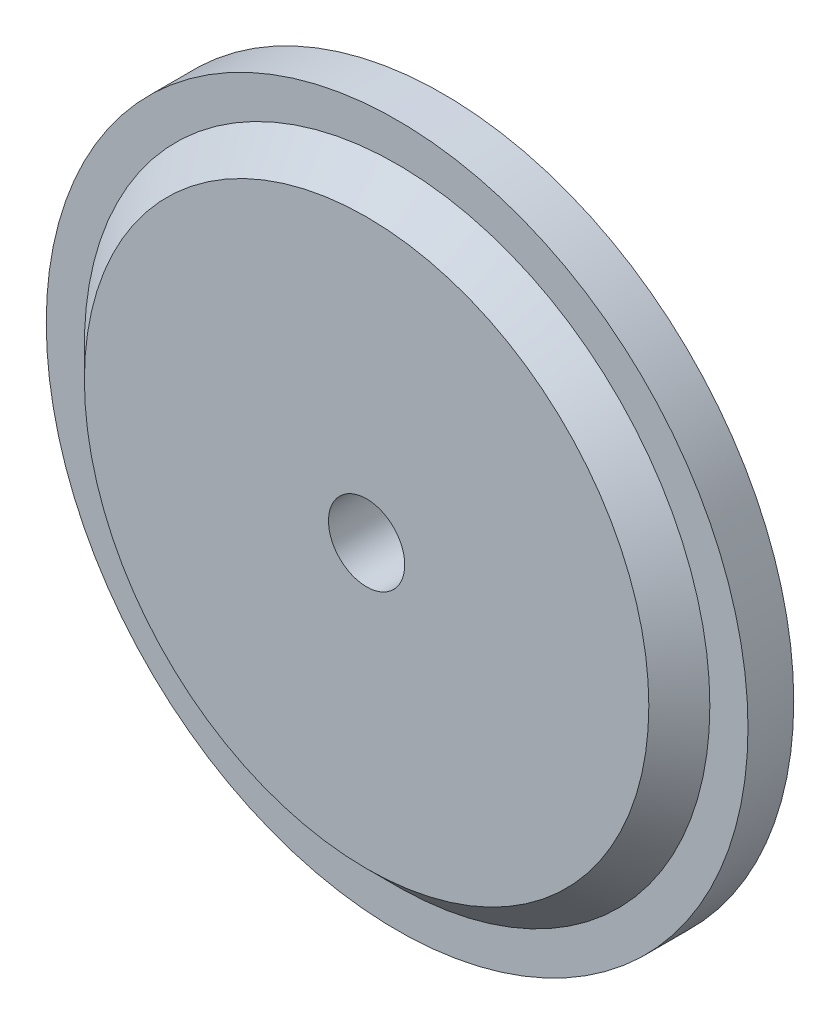
ISO-10303-21;
HEADER;
FILE_DESCRIPTION(('STEP AP214'),'2;1');
FILE_NAME('part.step','',(''),(''),'','','');
FILE_SCHEMA(('AUTOMOTIVE_DESIGN { 1 0 10303 214 1 1 1 1 }'));
ENDSEC;
DATA;
#1=APPLICATION_CONTEXT('core data for automotive mechanical design processes');
#2=APPLICATION_PROTOCOL_DEFINITION('international standard','automotive_design',2000,#1);
#3=PRODUCT_CONTEXT('',#1,'mechanical');
#4=PRODUCT('Part','Part','',(#3));
#5=PRODUCT_RELATED_PRODUCT_CATEGORY('part','',(#4));
#6=PRODUCT_DEFINITION_FORMATION('','',#4);
#7=PRODUCT_DEFINITION_CONTEXT('part definition',#1,'design');
#8=PRODUCT_DEFINITION('design','',#6,#7);
#9=PRODUCT_DEFINITION_SHAPE('','',#8);
#10=(LENGTH_UNIT() NAMED_UNIT(*) SI_UNIT(.MILLI.,.METRE.));
#11=(NAMED_UNIT(*) PLANE_ANGLE_UNIT() SI_UNIT($,.RADIAN.));
#12=(NAMED_UNIT(*) SI_UNIT($,.STERADIAN.) SOLID_ANGLE_UNIT());
#13=UNCERTAINTY_MEASURE_WITH_UNIT(LENGTH_MEASURE(1.E-05),#10,'distance_accuracy_value','');
#14=(GEOMETRIC_REPRESENTATION_CONTEXT(3) GLOBAL_UNCERTAINTY_ASSIGNED_CONTEXT((#13)) GLOBAL_UNIT_ASSIGNED_CONTEXT((#10,
#11,#12)) REPRESENTATION_CONTEXT('',''));
#15=CARTESIAN_POINT('',(0.,0.,0.));
#16=DIRECTION('',(0.,0.,1.));
#17=DIRECTION('',(1.,0.,0.));
#18=AXIS2_PLACEMENT_3D('',#15,#16,#17);
#19=CARTESIAN_POINT('',(0.,0.,6.35));
#20=DIRECTION('',(0.,0.,1.));
#21=DIRECTION('',(1.,0.,0.));
#22=AXIS2_PLACEMENT_3D('',#19,#20,#21);
#23=PLANE('',#22);
#24=CARTESIAN_POINT('',(0.,0.,6.35));
#25=DIRECTION('',(0.,0.,1.));
#26=DIRECTION('',(1.,0.,0.));
#27=AXIS2_PLACEMENT_3D('',#24,#25,#26);
#28=CIRCLE('',#27,3.175);
#29=CARTESIAN_POINT('',(3.175,0.,6.35));
#30=VERTEX_POINT('',#29);
#31=EDGE_CURVE('E39',#30,#30,#28,.T.);
#32=ORIENTED_EDGE('',*,*,#31,.F.);
#33=EDGE_LOOP('',(#32));
#34=FACE_BOUND('',#33,.T.);
#35=CARTESIAN_POINT('',(0.,0.,6.35));
#36=DIRECTION('',(0.,0.,1.));
#37=DIRECTION('',(1.,0.,0.));
#38=AXIS2_PLACEMENT_3D('',#35,#36,#37);
#39=CIRCLE('',#38,23.495);
#40=CARTESIAN_POINT('',(23.495,0.,6.35));
#41=VERTEX_POINT('',#40);
#42=EDGE_CURVE('E55',#41,#41,#39,.T.);
#43=ORIENTED_EDGE('',*,*,#42,.T.);
#44=EDGE_LOOP('',(#43));
#45=FACE_BOUND('',#44,.T.);
#46=ADVANCED_FACE('F32',(#34,#45),#23,.T.);
#47=CARTESIAN_POINT('',(0.,0.,6.35));
#48=DIRECTION('',(0.,0.,-1.));
#49=DIRECTION('',(-1.,0.,0.));
#50=AXIS2_PLACEMENT_3D('',#47,#48,#49);
#51=CYLINDRICAL_SURFACE('',#50,29.21);
#52=CARTESIAN_POINT('',(0.,0.,0.));
#53=DIRECTION('',(0.,0.,1.));
#54=DIRECTION('',(1.,0.,0.));
#55=AXIS2_PLACEMENT_3D('',#52,#53,#54);
#56=CIRCLE('',#55,29.21);
#57=CARTESIAN_POINT('',(29.21,0.,0.));
#58=VERTEX_POINT('',#57);
#59=EDGE_CURVE('E10',#58,#58,#56,.T.);
#60=ORIENTED_EDGE('',*,*,#59,.T.);
#61=EDGE_LOOP('',(#60));
#62=FACE_BOUND('',#61,.T.);
#63=CARTESIAN_POINT('',(0.,0.,3.81));
#64=DIRECTION('',(0.,0.,1.));
#65=DIRECTION('',(1.,0.,0.));
#66=AXIS2_PLACEMENT_3D('',#63,#64,#65);
#67=CIRCLE('',#66,29.21);
#68=CARTESIAN_POINT('',(29.21,0.,3.81));
#69=VERTEX_POINT('',#68);
#70=EDGE_CURVE('E48',#69,#69,#67,.T.);
#71=ORIENTED_EDGE('',*,*,#70,.F.);
#72=EDGE_LOOP('',(#71));
#73=FACE_BOUND('',#72,.T.);
#74=ADVANCED_FACE('F34',(#62,#73),#51,.T.);
#75=CARTESIAN_POINT('',(0.,0.,0.));
#76=DIRECTION('',(0.,0.,1.));
#77=DIRECTION('',(1.,0.,0.));
#78=AXIS2_PLACEMENT_3D('',#75,#76,#77);
#79=PLANE('',#78);
#80=ORIENTED_EDGE('',*,*,#59,.F.);
#81=EDGE_LOOP('',(#80));
#82=FACE_BOUND('',#81,.T.);
#83=CARTESIAN_POINT('',(0.,0.,0.));
#84=DIRECTION('',(0.,0.,1.));
#85=DIRECTION('',(1.,0.,0.));
#86=AXIS2_PLACEMENT_3D('',#83,#84,#85);
#87=CIRCLE('',#86,3.175);
#88=CARTESIAN_POINT('',(3.175,0.,0.));
#89=VERTEX_POINT('',#88);
#90=EDGE_CURVE('E43',#89,#89,#87,.T.);
#91=ORIENTED_EDGE('',*,*,#90,.T.);
#92=EDGE_LOOP('',(#91));
#93=FACE_BOUND('',#92,.T.);
#94=ADVANCED_FACE('F77',(#82,#93),#79,.F.);
#95=CARTESIAN_POINT('',(0.,0.,6.35));
#96=DIRECTION('',(0.,0.,-1.));
#97=DIRECTION('',(-1.,0.,0.));
#98=AXIS2_PLACEMENT_3D('',#95,#96,#97);
#99=CYLINDRICAL_SURFACE('',#98,3.175);
#100=ORIENTED_EDGE('',*,*,#31,.T.);
#101=EDGE_LOOP('',(#100));
#102=FACE_BOUND('',#101,.T.);
#103=ORIENTED_EDGE('',*,*,#90,.F.);
#104=EDGE_LOOP('',(#103));
#105=FACE_BOUND('',#104,.T.);
#106=ADVANCED_FACE('F68',(#102,#105),#99,.F.);
#107=CARTESIAN_POINT('',(0.,29.21,3.81));
#108=DIRECTION('',(0.,0.,1.));
#109=DIRECTION('',(1.,0.,0.));
#110=AXIS2_PLACEMENT_3D('',#107,#108,#109);
#111=PLANE('',#110);
#112=ORIENTED_EDGE('',*,*,#70,.T.);
#113=EDGE_LOOP('',(#112));
#114=FACE_BOUND('',#113,.T.);
#115=CARTESIAN_POINT('',(0.,0.,3.81));
#116=DIRECTION('',(0.,0.,1.));
#117=DIRECTION('',(1.,0.,0.));
#118=AXIS2_PLACEMENT_3D('',#115,#116,#117);
#119=CIRCLE('',#118,26.035);
#120=CARTESIAN_POINT('',(26.035,0.,3.81));
#121=VERTEX_POINT('',#120);
#122=EDGE_CURVE('E52',#121,#121,#119,.T.);
#123=ORIENTED_EDGE('',*,*,#122,.F.);
#124=EDGE_LOOP('',(#123));
#125=FACE_BOUND('',#124,.T.);
#126=ADVANCED_FACE('F62',(#114,#125),#111,.T.);
#127=CARTESIAN_POINT('',(0.,0.,6.35));
#128=DIRECTION('',(0.,0.,-1.));
#129=DIRECTION('',(-1.,0.,0.));
#130=AXIS2_PLACEMENT_3D('',#127,#128,#129);
#131=CONICAL_SURFACE('',#130,23.495,0.785398163397447);
#132=ORIENTED_EDGE('',*,*,#122,.T.);
#133=EDGE_LOOP('',(#132));
#134=FACE_BOUND('',#133,.T.);
#135=ORIENTED_EDGE('',*,*,#42,.F.);
#136=EDGE_LOOP('',(#135));
#137=FACE_BOUND('',#136,.T.);
#138=ADVANCED_FACE('F60',(#134,#137),#131,.T.);
#139=CLOSED_SHELL('',(#46,#74,#94,#106,#126,#138));
#140=MANIFOLD_SOLID_BREP('B2',#139);
#141=ADVANCED_BREP_SHAPE_REPRESENTATION('',(#18,#140),#14);
#142=SHAPE_DEFINITION_REPRESENTATION(#9,#141);
ENDSEC;
END-ISO-10303-21;
